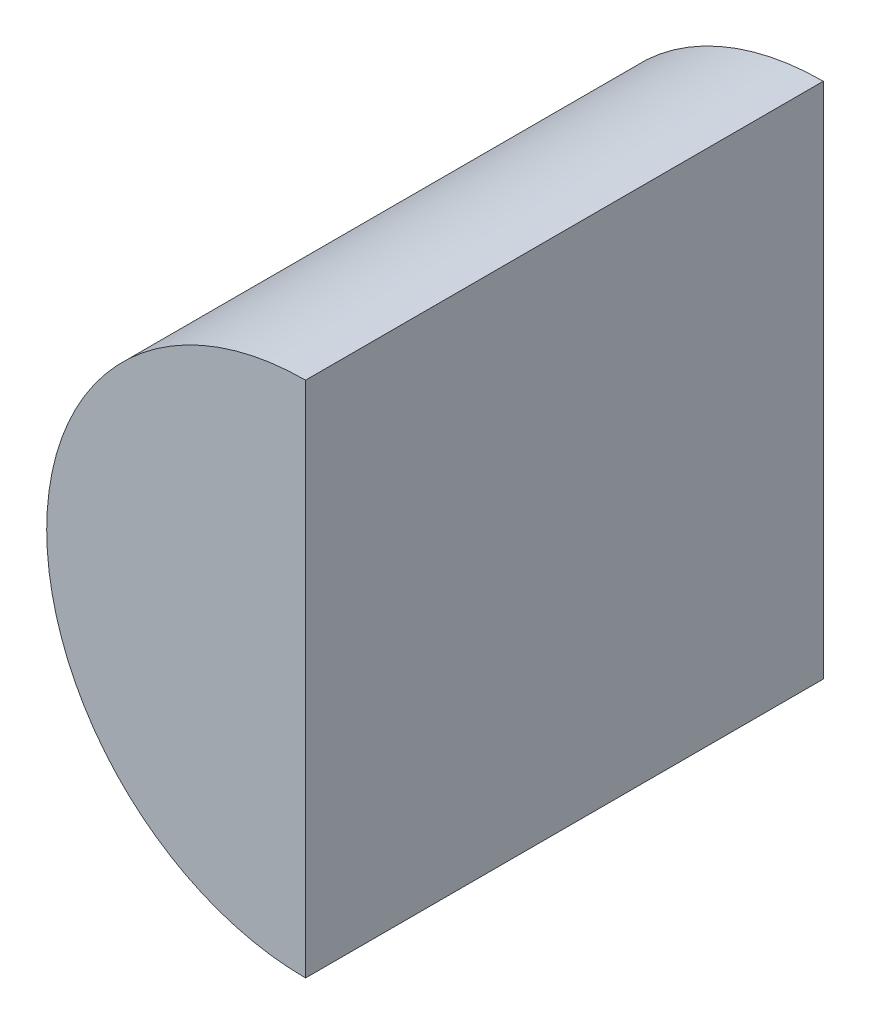
ISO-10303-21;
HEADER;
FILE_DESCRIPTION(('STEP AP214'),'2;1');
FILE_NAME('part.step','',(''),(''),'','','');
FILE_SCHEMA(('AUTOMOTIVE_DESIGN { 1 0 10303 214 1 1 1 1 }'));
ENDSEC;
DATA;
#1=APPLICATION_CONTEXT('core data for automotive mechanical design processes');
#2=APPLICATION_PROTOCOL_DEFINITION('international standard','automotive_design',2000,#1);
#3=PRODUCT_CONTEXT('',#1,'mechanical');
#4=PRODUCT('Part','Part','',(#3));
#5=PRODUCT_RELATED_PRODUCT_CATEGORY('part','',(#4));
#6=PRODUCT_DEFINITION_FORMATION('','',#4);
#7=PRODUCT_DEFINITION_CONTEXT('part definition',#1,'design');
#8=PRODUCT_DEFINITION('design','',#6,#7);
#9=PRODUCT_DEFINITION_SHAPE('','',#8);
#10=(LENGTH_UNIT() NAMED_UNIT(*) SI_UNIT(.MILLI.,.METRE.));
#11=(NAMED_UNIT(*) PLANE_ANGLE_UNIT() SI_UNIT($,.RADIAN.));
#12=(NAMED_UNIT(*) SI_UNIT($,.STERADIAN.) SOLID_ANGLE_UNIT());
#13=UNCERTAINTY_MEASURE_WITH_UNIT(LENGTH_MEASURE(1.E-05),#10,'distance_accuracy_value','');
#14=(GEOMETRIC_REPRESENTATION_CONTEXT(3) GLOBAL_UNCERTAINTY_ASSIGNED_CONTEXT((#13)) GLOBAL_UNIT_ASSIGNED_CONTEXT((#10,
#11,#12)) REPRESENTATION_CONTEXT('',''));
#15=CARTESIAN_POINT('',(0.,0.,0.));
#16=DIRECTION('',(0.,0.,1.));
#17=DIRECTION('',(1.,0.,0.));
#18=AXIS2_PLACEMENT_3D('',#15,#16,#17);
#19=CARTESIAN_POINT('',(0.,0.,50.));
#20=DIRECTION('',(0.,0.,-1.));
#21=DIRECTION('',(-1.,0.,0.));
#22=AXIS2_PLACEMENT_3D('',#19,#20,#21);
#23=CYLINDRICAL_SURFACE('',#22,25.);
#24=CARTESIAN_POINT('',(0.,0.,0.));
#25=DIRECTION('',(0.,0.,1.));
#26=DIRECTION('',(1.,0.,0.));
#27=AXIS2_PLACEMENT_3D('',#24,#25,#26);
#28=CIRCLE('',#27,25.);
#29=CARTESIAN_POINT('',(0.,25.,0.));
#30=VERTEX_POINT('',#29);
#31=CARTESIAN_POINT('',(0.,-25.,0.));
#32=VERTEX_POINT('',#31);
#33=EDGE_CURVE('E64',#30,#32,#28,.T.);
#34=ORIENTED_EDGE('',*,*,#33,.T.);
#35=DIRECTION('',(0.,0.,-1.));
#36=VECTOR('',#35,1.);
#37=CARTESIAN_POINT('',(0.,-25.,50.));
#38=LINE('',#37,#36);
#39=CARTESIAN_POINT('',(0.,-25.,50.));
#40=VERTEX_POINT('',#39);
#41=EDGE_CURVE('E11',#40,#32,#38,.T.);
#42=ORIENTED_EDGE('',*,*,#41,.F.);
#43=CARTESIAN_POINT('',(0.,0.,50.));
#44=DIRECTION('',(0.,0.,1.));
#45=DIRECTION('',(1.,0.,0.));
#46=AXIS2_PLACEMENT_3D('',#43,#44,#45);
#47=CIRCLE('',#46,25.);
#48=CARTESIAN_POINT('',(0.,25.,50.));
#49=VERTEX_POINT('',#48);
#50=EDGE_CURVE('E63',#49,#40,#47,.T.);
#51=ORIENTED_EDGE('',*,*,#50,.F.);
#52=DIRECTION('',(0.,0.,-1.));
#53=VECTOR('',#52,1.);
#54=CARTESIAN_POINT('',(0.,25.,50.));
#55=LINE('',#54,#53);
#56=EDGE_CURVE('E41',#49,#30,#55,.T.);
#57=ORIENTED_EDGE('',*,*,#56,.T.);
#58=EDGE_LOOP('',(#34,#42,#51,#57));
#59=FACE_BOUND('',#58,.T.);
#60=ADVANCED_FACE('F33',(#59),#23,.T.);
#61=CARTESIAN_POINT('',(0.,25.,50.));
#62=DIRECTION('',(-1.,0.,0.));
#63=DIRECTION('',(0.,0.,1.));
#64=AXIS2_PLACEMENT_3D('',#61,#62,#63);
#65=PLANE('',#64);
#66=DIRECTION('',(0.,1.,0.));
#67=VECTOR('',#66,1.);
#68=CARTESIAN_POINT('',(0.,25.,0.));
#69=LINE('',#68,#67);
#70=EDGE_CURVE('E56',#32,#30,#69,.T.);
#71=ORIENTED_EDGE('',*,*,#70,.T.);
#72=ORIENTED_EDGE('',*,*,#56,.F.);
#73=DIRECTION('',(0.,1.,0.));
#74=VECTOR('',#73,1.);
#75=CARTESIAN_POINT('',(0.,25.,50.));
#76=LINE('',#75,#74);
#77=EDGE_CURVE('E48',#40,#49,#76,.T.);
#78=ORIENTED_EDGE('',*,*,#77,.F.);
#79=ORIENTED_EDGE('',*,*,#41,.T.);
#80=EDGE_LOOP('',(#71,#72,#78,#79));
#81=FACE_BOUND('',#80,.T.);
#82=ADVANCED_FACE('F59',(#81),#65,.F.);
#83=CARTESIAN_POINT('',(0.,0.,50.));
#84=DIRECTION('',(0.,0.,1.));
#85=DIRECTION('',(1.,0.,0.));
#86=AXIS2_PLACEMENT_3D('',#83,#84,#85);
#87=PLANE('',#86);
#88=ORIENTED_EDGE('',*,*,#50,.T.);
#89=ORIENTED_EDGE('',*,*,#77,.T.);
#90=EDGE_LOOP('',(#88,#89));
#91=FACE_BOUND('',#90,.T.);
#92=ADVANCED_FACE('F82',(#91),#87,.T.);
#93=CARTESIAN_POINT('',(0.,0.,0.));
#94=DIRECTION('',(0.,0.,1.));
#95=DIRECTION('',(1.,0.,0.));
#96=AXIS2_PLACEMENT_3D('',#93,#94,#95);
#97=PLANE('',#96);
#98=CARTESIAN_POINT('',(-10.746576251326,0.,0.));
#99=DIRECTION('',(0.,0.,-1.));
#100=DIRECTION('',(-1.,0.,0.));
#101=AXIS2_PLACEMENT_3D('',#98,#99,#100);
#102=CIRCLE('',#101,5.);
#103=CARTESIAN_POINT('',(-15.746576251326,0.,0.));
#104=VERTEX_POINT('',#103);
#105=EDGE_CURVE('E71',#104,#104,#102,.T.);
#106=ORIENTED_EDGE('',*,*,#105,.F.);
#107=EDGE_LOOP('',(#106));
#108=FACE_BOUND('',#107,.T.);
#109=ORIENTED_EDGE('',*,*,#33,.F.);
#110=ORIENTED_EDGE('',*,*,#70,.F.);
#111=EDGE_LOOP('',(#109,#110));
#112=FACE_BOUND('',#111,.T.);
#113=ADVANCED_FACE('F67',(#108,#112),#97,.F.);
#114=CARTESIAN_POINT('',(-10.746576251326,0.,10.));
#115=DIRECTION('',(0.,0.,-1.));
#116=DIRECTION('',(-1.,0.,0.));
#117=AXIS2_PLACEMENT_3D('',#114,#115,#116);
#118=CYLINDRICAL_SURFACE('',#117,5.);
#119=CARTESIAN_POINT('',(-10.746576251326,0.,10.));
#120=DIRECTION('',(0.,0.,-1.));
#121=DIRECTION('',(-1.,0.,0.));
#122=AXIS2_PLACEMENT_3D('',#119,#120,#121);
#123=CIRCLE('',#122,5.);
#124=CARTESIAN_POINT('',(-15.746576251326,0.,10.));
#125=VERTEX_POINT('',#124);
#126=EDGE_CURVE('E68',#125,#125,#123,.T.);
#127=ORIENTED_EDGE('',*,*,#126,.F.);
#128=EDGE_LOOP('',(#127));
#129=FACE_BOUND('',#128,.T.);
#130=ORIENTED_EDGE('',*,*,#105,.T.);
#131=EDGE_LOOP('',(#130));
#132=FACE_BOUND('',#131,.T.);
#133=ADVANCED_FACE('F79',(#129,#132),#118,.F.);
#134=CARTESIAN_POINT('',(-10.746576251326,0.,10.));
#135=DIRECTION('',(0.,0.,-1.));
#136=DIRECTION('',(-1.,0.,0.));
#137=AXIS2_PLACEMENT_3D('',#134,#135,#136);
#138=PLANE('',#137);
#139=ORIENTED_EDGE('',*,*,#126,.T.);
#140=EDGE_LOOP('',(#139));
#141=FACE_BOUND('',#140,.T.);
#142=ADVANCED_FACE('F88',(#141),#138,.T.);
#143=CLOSED_SHELL('',(#60,#82,#92,#113,#133,#142));
#144=MANIFOLD_SOLID_BREP('B2',#143);
#145=ADVANCED_BREP_SHAPE_REPRESENTATION('',(#18,#144),#14);
#146=SHAPE_DEFINITION_REPRESENTATION(#9,#145);
ENDSEC;
END-ISO-10303-21;
